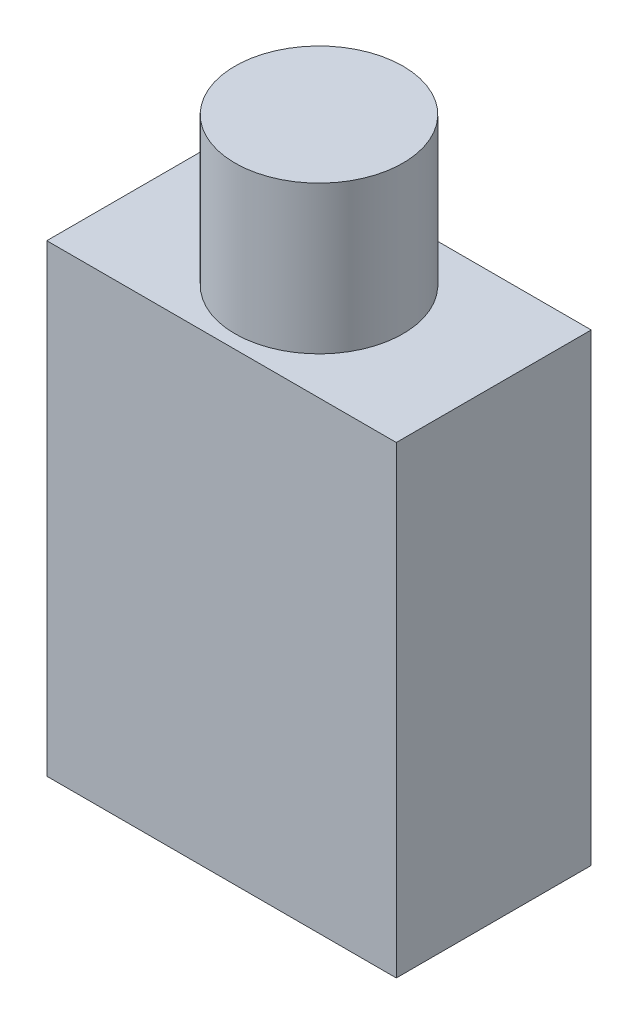
ISO-10303-21;
HEADER;
FILE_DESCRIPTION(('STEP AP214'),'2;1');
FILE_NAME('part.step','',(''),(''),'','','');
FILE_SCHEMA(('AUTOMOTIVE_DESIGN { 1 0 10303 214 1 1 1 1 }'));
ENDSEC;
DATA;
#1=APPLICATION_CONTEXT('core data for automotive mechanical design processes');
#2=APPLICATION_PROTOCOL_DEFINITION('international standard','automotive_design',2000,#1);
#3=PRODUCT_CONTEXT('',#1,'mechanical');
#4=PRODUCT('Part','Part','',(#3));
#5=PRODUCT_RELATED_PRODUCT_CATEGORY('part','',(#4));
#6=PRODUCT_DEFINITION_FORMATION('','',#4);
#7=PRODUCT_DEFINITION_CONTEXT('part definition',#1,'design');
#8=PRODUCT_DEFINITION('design','',#6,#7);
#9=PRODUCT_DEFINITION_SHAPE('','',#8);
#10=(LENGTH_UNIT() NAMED_UNIT(*) SI_UNIT(.MILLI.,.METRE.));
#11=(NAMED_UNIT(*) PLANE_ANGLE_UNIT() SI_UNIT($,.RADIAN.));
#12=(NAMED_UNIT(*) SI_UNIT($,.STERADIAN.) SOLID_ANGLE_UNIT());
#13=UNCERTAINTY_MEASURE_WITH_UNIT(LENGTH_MEASURE(1.E-05),#10,'distance_accuracy_value','');
#14=(GEOMETRIC_REPRESENTATION_CONTEXT(3) GLOBAL_UNCERTAINTY_ASSIGNED_CONTEXT((#13)) GLOBAL_UNIT_ASSIGNED_CONTEXT((#10,
#11,#12)) REPRESENTATION_CONTEXT('',''));
#15=CARTESIAN_POINT('',(0.,0.,0.));
#16=DIRECTION('',(0.,0.,1.));
#17=DIRECTION('',(1.,0.,0.));
#18=AXIS2_PLACEMENT_3D('',#15,#16,#17);
#19=CARTESIAN_POINT('',(0.,0.,29.));
#20=DIRECTION('',(1.,0.,0.));
#21=DIRECTION('',(0.,1.,0.));
#22=AXIS2_PLACEMENT_3D('',#19,#20,#21);
#23=PLANE('',#22);
#24=DIRECTION('',(0.,-1.,0.));
#25=VECTOR('',#24,1.);
#26=CARTESIAN_POINT('',(0.,0.,0.));
#27=LINE('',#26,#25);
#28=CARTESIAN_POINT('',(0.,0.,0.));
#29=VERTEX_POINT('',#28);
#30=CARTESIAN_POINT('',(0.,-69.,0.));
#31=VERTEX_POINT('',#30);
#32=EDGE_CURVE('E99',#29,#31,#27,.T.);
#33=ORIENTED_EDGE('',*,*,#32,.T.);
#34=DIRECTION('',(0.,0.,-1.));
#35=VECTOR('',#34,1.);
#36=CARTESIAN_POINT('',(0.,-69.,29.));
#37=LINE('',#36,#35);
#38=CARTESIAN_POINT('',(0.,-69.,29.));
#39=VERTEX_POINT('',#38);
#40=EDGE_CURVE('E41',#39,#31,#37,.T.);
#41=ORIENTED_EDGE('',*,*,#40,.F.);
#42=DIRECTION('',(0.,-1.,0.));
#43=VECTOR('',#42,1.);
#44=CARTESIAN_POINT('',(0.,0.,29.));
#45=LINE('',#44,#43);
#46=CARTESIAN_POINT('',(0.,0.,29.));
#47=VERTEX_POINT('',#46);
#48=EDGE_CURVE('E85',#47,#39,#45,.T.);
#49=ORIENTED_EDGE('',*,*,#48,.F.);
#50=DIRECTION('',(0.,0.,-1.));
#51=VECTOR('',#50,1.);
#52=CARTESIAN_POINT('',(0.,0.,29.));
#53=LINE('',#52,#51);
#54=EDGE_CURVE('E95',#47,#29,#53,.T.);
#55=ORIENTED_EDGE('',*,*,#54,.T.);
#56=EDGE_LOOP('',(#33,#41,#49,#55));
#57=FACE_BOUND('',#56,.T.);
#58=ADVANCED_FACE('F33',(#57),#23,.F.);
#59=CARTESIAN_POINT('',(0.,-69.,29.));
#60=DIRECTION('',(0.,1.,0.));
#61=DIRECTION('',(0.,0.,1.));
#62=AXIS2_PLACEMENT_3D('',#59,#60,#61);
#63=PLANE('',#62);
#64=DIRECTION('',(1.,0.,0.));
#65=VECTOR('',#64,1.);
#66=CARTESIAN_POINT('',(0.,-69.,0.));
#67=LINE('',#66,#65);
#68=CARTESIAN_POINT('',(52.,-69.,0.));
#69=VERTEX_POINT('',#68);
#70=EDGE_CURVE('E90',#31,#69,#67,.T.);
#71=ORIENTED_EDGE('',*,*,#70,.T.);
#72=DIRECTION('',(0.,0.,-1.));
#73=VECTOR('',#72,1.);
#74=CARTESIAN_POINT('',(52.,-69.,29.));
#75=LINE('',#74,#73);
#76=CARTESIAN_POINT('',(52.,-69.,29.));
#77=VERTEX_POINT('',#76);
#78=EDGE_CURVE('E88',#77,#69,#75,.T.);
#79=ORIENTED_EDGE('',*,*,#78,.F.);
#80=DIRECTION('',(1.,0.,0.));
#81=VECTOR('',#80,1.);
#82=CARTESIAN_POINT('',(0.,-69.,29.));
#83=LINE('',#82,#81);
#84=EDGE_CURVE('E80',#39,#77,#83,.T.);
#85=ORIENTED_EDGE('',*,*,#84,.F.);
#86=ORIENTED_EDGE('',*,*,#40,.T.);
#87=EDGE_LOOP('',(#71,#79,#85,#86));
#88=FACE_BOUND('',#87,.T.);
#89=ADVANCED_FACE('F89',(#88),#63,.F.);
#90=CARTESIAN_POINT('',(52.,0.,29.));
#91=DIRECTION('',(-1.,0.,0.));
#92=DIRECTION('',(0.,-1.,0.));
#93=AXIS2_PLACEMENT_3D('',#90,#91,#92);
#94=PLANE('',#93);
#95=DIRECTION('',(0.,1.,0.));
#96=VECTOR('',#95,1.);
#97=CARTESIAN_POINT('',(52.,0.,0.));
#98=LINE('',#97,#96);
#99=CARTESIAN_POINT('',(52.,0.,0.));
#100=VERTEX_POINT('',#99);
#101=EDGE_CURVE('E66',#69,#100,#98,.T.);
#102=ORIENTED_EDGE('',*,*,#101,.T.);
#103=DIRECTION('',(0.,0.,-1.));
#104=VECTOR('',#103,1.);
#105=CARTESIAN_POINT('',(52.,0.,29.));
#106=LINE('',#105,#104);
#107=CARTESIAN_POINT('',(52.,0.,29.));
#108=VERTEX_POINT('',#107);
#109=EDGE_CURVE('E91',#108,#100,#106,.T.);
#110=ORIENTED_EDGE('',*,*,#109,.F.);
#111=DIRECTION('',(0.,1.,0.));
#112=VECTOR('',#111,1.);
#113=CARTESIAN_POINT('',(52.,0.,29.));
#114=LINE('',#113,#112);
#115=EDGE_CURVE('E83',#77,#108,#114,.T.);
#116=ORIENTED_EDGE('',*,*,#115,.F.);
#117=ORIENTED_EDGE('',*,*,#78,.T.);
#118=EDGE_LOOP('',(#102,#110,#116,#117));
#119=FACE_BOUND('',#118,.T.);
#120=ADVANCED_FACE('F93',(#119),#94,.F.);
#121=CARTESIAN_POINT('',(0.,0.,29.));
#122=DIRECTION('',(0.,-1.,0.));
#123=DIRECTION('',(0.,0.,-1.));
#124=AXIS2_PLACEMENT_3D('',#121,#122,#123);
#125=PLANE('',#124);
#126=CARTESIAN_POINT('',(26.,0.,14.5));
#127=DIRECTION('',(0.,-1.,0.));
#128=DIRECTION('',(0.,0.,-1.));
#129=AXIS2_PLACEMENT_3D('',#126,#127,#128);
#130=CIRCLE('',#129,12.5);
#131=CARTESIAN_POINT('',(26.,0.,1.99999999999999));
#132=VERTEX_POINT('',#131);
#133=EDGE_CURVE('E11',#132,#132,#130,.F.);
#134=ORIENTED_EDGE('',*,*,#133,.F.);
#135=EDGE_LOOP('',(#134));
#136=FACE_BOUND('',#135,.T.);
#137=DIRECTION('',(-1.,0.,0.));
#138=VECTOR('',#137,1.);
#139=CARTESIAN_POINT('',(0.,0.,0.));
#140=LINE('',#139,#138);
#141=EDGE_CURVE('E72',#100,#29,#140,.T.);
#142=ORIENTED_EDGE('',*,*,#141,.T.);
#143=ORIENTED_EDGE('',*,*,#54,.F.);
#144=DIRECTION('',(-1.,0.,0.));
#145=VECTOR('',#144,1.);
#146=CARTESIAN_POINT('',(0.,0.,29.));
#147=LINE('',#146,#145);
#148=EDGE_CURVE('E49',#108,#47,#147,.T.);
#149=ORIENTED_EDGE('',*,*,#148,.F.);
#150=ORIENTED_EDGE('',*,*,#109,.T.);
#151=EDGE_LOOP('',(#142,#143,#149,#150));
#152=FACE_BOUND('',#151,.T.);
#153=ADVANCED_FACE('F121',(#136,#152),#125,.F.);
#154=CARTESIAN_POINT('',(0.,0.,29.));
#155=DIRECTION('',(0.,0.,1.));
#156=DIRECTION('',(1.,0.,0.));
#157=AXIS2_PLACEMENT_3D('',#154,#155,#156);
#158=PLANE('',#157);
#159=ORIENTED_EDGE('',*,*,#48,.T.);
#160=ORIENTED_EDGE('',*,*,#84,.T.);
#161=ORIENTED_EDGE('',*,*,#115,.T.);
#162=ORIENTED_EDGE('',*,*,#148,.T.);
#163=EDGE_LOOP('',(#159,#160,#161,#162));
#164=FACE_BOUND('',#163,.T.);
#165=ADVANCED_FACE('F81',(#164),#158,.T.);
#166=CARTESIAN_POINT('',(0.,0.,0.));
#167=DIRECTION('',(0.,0.,1.));
#168=DIRECTION('',(1.,0.,0.));
#169=AXIS2_PLACEMENT_3D('',#166,#167,#168);
#170=PLANE('',#169);
#171=ORIENTED_EDGE('',*,*,#32,.F.);
#172=ORIENTED_EDGE('',*,*,#141,.F.);
#173=ORIENTED_EDGE('',*,*,#101,.F.);
#174=ORIENTED_EDGE('',*,*,#70,.F.);
#175=EDGE_LOOP('',(#171,#172,#173,#174));
#176=FACE_BOUND('',#175,.T.);
#177=ADVANCED_FACE('F110',(#176),#170,.F.);
#178=CARTESIAN_POINT('',(26.,22.,14.5));
#179=DIRECTION('',(0.,-1.,0.));
#180=DIRECTION('',(0.,0.,-1.));
#181=AXIS2_PLACEMENT_3D('',#178,#179,#180);
#182=CYLINDRICAL_SURFACE('',#181,12.5);
#183=CARTESIAN_POINT('',(26.,22.,14.5));
#184=DIRECTION('',(0.,1.,0.));
#185=DIRECTION('',(0.,0.,1.));
#186=AXIS2_PLACEMENT_3D('',#183,#184,#185);
#187=CIRCLE('',#186,12.5);
#188=CARTESIAN_POINT('',(26.,22.,27.));
#189=VERTEX_POINT('',#188);
#190=EDGE_CURVE('E102',#189,#189,#187,.T.);
#191=ORIENTED_EDGE('',*,*,#190,.F.);
#192=EDGE_LOOP('',(#191));
#193=FACE_BOUND('',#192,.T.);
#194=ORIENTED_EDGE('',*,*,#133,.T.);
#195=EDGE_LOOP('',(#194));
#196=FACE_BOUND('',#195,.T.);
#197=ADVANCED_FACE('F112',(#193,#196),#182,.T.);
#198=CARTESIAN_POINT('',(26.,22.,14.5));
#199=DIRECTION('',(0.,1.,0.));
#200=DIRECTION('',(0.,0.,1.));
#201=AXIS2_PLACEMENT_3D('',#198,#199,#200);
#202=PLANE('',#201);
#203=ORIENTED_EDGE('',*,*,#190,.T.);
#204=EDGE_LOOP('',(#203));
#205=FACE_BOUND('',#204,.T.);
#206=ADVANCED_FACE('F118',(#205),#202,.T.);
#207=CLOSED_SHELL('',(#58,#89,#120,#153,#165,#177,#197,#206));
#208=MANIFOLD_SOLID_BREP('B2',#207);
#209=ADVANCED_BREP_SHAPE_REPRESENTATION('',(#18,#208),#14);
#210=SHAPE_DEFINITION_REPRESENTATION(#9,#209);
ENDSEC;
END-ISO-10303-21;
